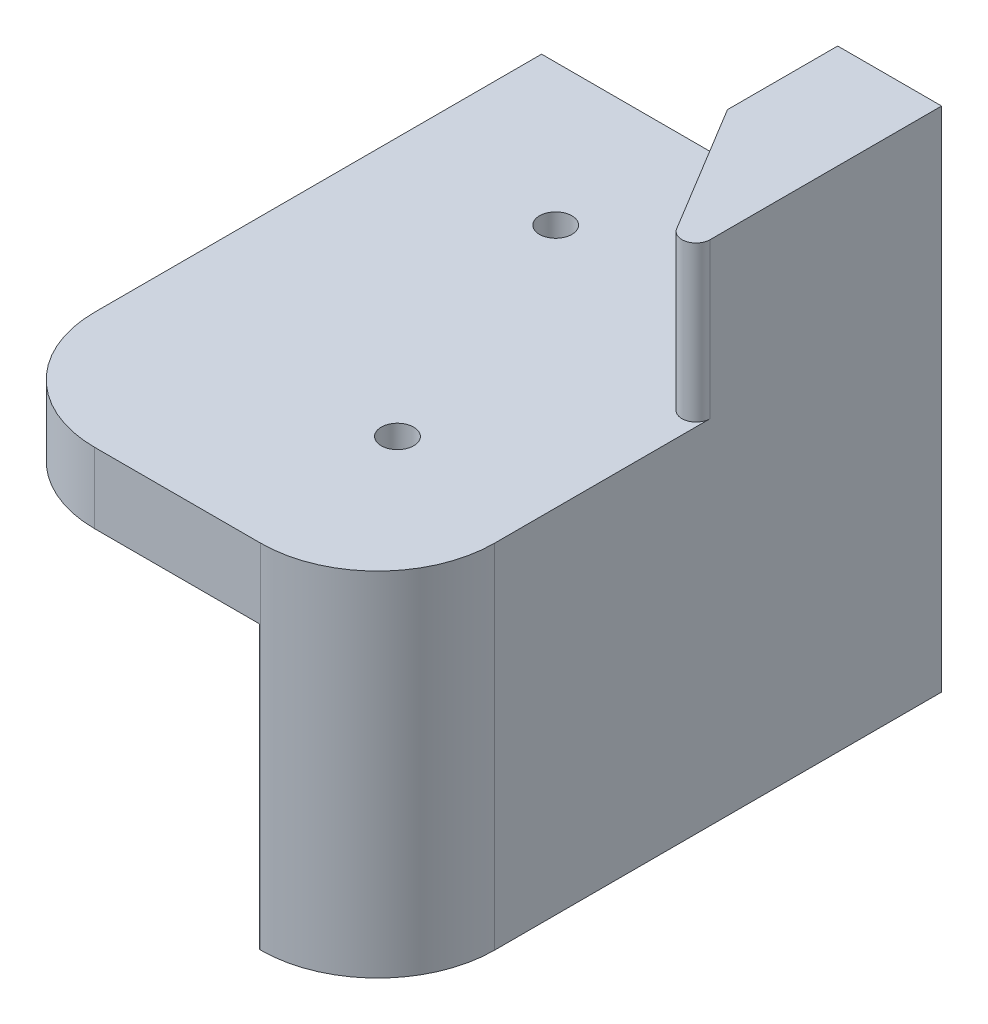
ISO-10303-21;
HEADER;
FILE_DESCRIPTION(('STEP AP214'),'2;1');
FILE_NAME('part.step','',(''),(''),'','','');
FILE_SCHEMA(('AUTOMOTIVE_DESIGN { 1 0 10303 214 1 1 1 1 }'));
ENDSEC;
DATA;
#1=APPLICATION_CONTEXT('core data for automotive mechanical design processes');
#2=APPLICATION_PROTOCOL_DEFINITION('international standard','automotive_design',2000,#1);
#3=PRODUCT_CONTEXT('',#1,'mechanical');
#4=PRODUCT('Part','Part','',(#3));
#5=PRODUCT_RELATED_PRODUCT_CATEGORY('part','',(#4));
#6=PRODUCT_DEFINITION_FORMATION('','',#4);
#7=PRODUCT_DEFINITION_CONTEXT('part definition',#1,'design');
#8=PRODUCT_DEFINITION('design','',#6,#7);
#9=PRODUCT_DEFINITION_SHAPE('','',#8);
#10=(LENGTH_UNIT() NAMED_UNIT(*) SI_UNIT(.MILLI.,.METRE.));
#11=(NAMED_UNIT(*) PLANE_ANGLE_UNIT() SI_UNIT($,.RADIAN.));
#12=(NAMED_UNIT(*) SI_UNIT($,.STERADIAN.) SOLID_ANGLE_UNIT());
#13=UNCERTAINTY_MEASURE_WITH_UNIT(LENGTH_MEASURE(1.E-05),#10,'distance_accuracy_value','');
#14=(GEOMETRIC_REPRESENTATION_CONTEXT(3) GLOBAL_UNCERTAINTY_ASSIGNED_CONTEXT((#13)) GLOBAL_UNIT_ASSIGNED_CONTEXT((#10,
#11,#12)) REPRESENTATION_CONTEXT('',''));
#15=CARTESIAN_POINT('',(0.,0.,0.));
#16=DIRECTION('',(0.,0.,1.));
#17=DIRECTION('',(1.,0.,0.));
#18=AXIS2_PLACEMENT_3D('',#15,#16,#17);
#19=CARTESIAN_POINT('',(0.,16.,0.));
#20=DIRECTION('',(0.,-1.,0.));
#21=DIRECTION('',(0.,0.,-1.));
#22=AXIS2_PLACEMENT_3D('',#19,#20,#21);
#23=PLANE('',#22);
#24=CARTESIAN_POINT('',(13.185,16.,-3.58458045626301));
#25=DIRECTION('',(0.,1.,0.));
#26=DIRECTION('',(0.,0.,1.));
#27=AXIS2_PLACEMENT_3D('',#24,#25,#26);
#28=CIRCLE('',#27,1.);
#29=CARTESIAN_POINT('',(12.3294124958943,16.,-3.0669222458402));
#30=VERTEX_POINT('',#29);
#31=CARTESIAN_POINT('',(14.185,16.,-3.58458045626301));
#32=VERTEX_POINT('',#31);
#33=EDGE_CURVE('E198',#30,#32,#28,.T.);
#34=ORIENTED_EDGE('',*,*,#33,.T.);
#35=DIRECTION('',(0.,0.,1.));
#36=VECTOR('',#35,1.);
#37=CARTESIAN_POINT('',(14.185,16.,20.));
#38=LINE('',#37,#36);
#39=CARTESIAN_POINT('',(14.185,16.,-20.));
#40=VERTEX_POINT('',#39);
#41=EDGE_CURVE('E39',#40,#32,#38,.T.);
#42=ORIENTED_EDGE('',*,*,#41,.F.);
#43=DIRECTION('',(1.,0.,0.));
#44=VECTOR('',#43,1.);
#45=CARTESIAN_POINT('',(-14.185,16.,-20.));
#46=LINE('',#45,#44);
#47=CARTESIAN_POINT('',(6.815,16.,-20.));
#48=VERTEX_POINT('',#47);
#49=EDGE_CURVE('E217',#48,#40,#46,.T.);
#50=ORIENTED_EDGE('',*,*,#49,.F.);
#51=DIRECTION('',(0.,0.,1.));
#52=VECTOR('',#51,1.);
#53=CARTESIAN_POINT('',(6.815,16.,-20.));
#54=LINE('',#53,#52);
#55=CARTESIAN_POINT('',(6.815,16.,-12.1811646725524));
#56=VERTEX_POINT('',#55);
#57=EDGE_CURVE('E11',#48,#56,#54,.T.);
#58=ORIENTED_EDGE('',*,*,#57,.T.);
#59=DIRECTION('',(0.517658210422817,0.,0.855587504105715));
#60=VECTOR('',#59,1.);
#61=CARTESIAN_POINT('',(6.815,16.,-12.1811646725524));
#62=LINE('',#61,#60);
#63=EDGE_CURVE('E44',#56,#30,#62,.T.);
#64=ORIENTED_EDGE('',*,*,#63,.T.);
#65=EDGE_LOOP('',(#34,#42,#50,#58,#64));
#66=FACE_BOUND('',#65,.T.);
#67=ADVANCED_FACE('F36',(#66),#23,.F.);
#68=CARTESIAN_POINT('',(0.,5.,0.));
#69=DIRECTION('',(0.,-1.,0.));
#70=DIRECTION('',(0.,0.,-1.));
#71=AXIS2_PLACEMENT_3D('',#68,#69,#70);
#72=PLANE('',#71);
#73=CARTESIAN_POINT('',(4.185,5.,8.59255496159686));
#74=DIRECTION('',(0.,-1.,0.));
#75=DIRECTION('',(0.,0.,-1.));
#76=AXIS2_PLACEMENT_3D('',#73,#74,#75);
#77=CIRCLE('',#76,1.15);
#78=CARTESIAN_POINT('',(4.185,5.,7.44255496159686));
#79=VERTEX_POINT('',#78);
#80=EDGE_CURVE('E138',#79,#79,#77,.T.);
#81=ORIENTED_EDGE('',*,*,#80,.T.);
#82=EDGE_LOOP('',(#81));
#83=FACE_BOUND('',#82,.T.);
#84=CARTESIAN_POINT('',(-3.185,5.,-10.));
#85=DIRECTION('',(0.,-1.,0.));
#86=DIRECTION('',(0.,0.,-1.));
#87=AXIS2_PLACEMENT_3D('',#84,#85,#86);
#88=CIRCLE('',#87,1.1485231685851);
#89=CARTESIAN_POINT('',(-3.185,5.,-11.1485231685851));
#90=VERTEX_POINT('',#89);
#91=EDGE_CURVE('E165',#90,#90,#88,.T.);
#92=ORIENTED_EDGE('',*,*,#91,.T.);
#93=EDGE_LOOP('',(#92));
#94=FACE_BOUND('',#93,.T.);
#95=DIRECTION('',(0.,0.,1.));
#96=VECTOR('',#95,1.);
#97=CARTESIAN_POINT('',(-14.185,5.,20.));
#98=LINE('',#97,#96);
#99=CARTESIAN_POINT('',(-14.185,5.,-20.));
#100=VERTEX_POINT('',#99);
#101=CARTESIAN_POINT('',(-14.185,5.,11.7));
#102=VERTEX_POINT('',#101);
#103=EDGE_CURVE('E176',#100,#102,#98,.T.);
#104=ORIENTED_EDGE('',*,*,#103,.T.);
#105=CARTESIAN_POINT('',(-5.885,5.,11.7));
#106=DIRECTION('',(0.,-1.,0.));
#107=DIRECTION('',(0.,0.,-1.));
#108=AXIS2_PLACEMENT_3D('',#105,#106,#107);
#109=CIRCLE('',#108,8.3);
#110=CARTESIAN_POINT('',(-5.885,5.,20.));
#111=VERTEX_POINT('',#110);
#112=EDGE_CURVE('E211',#102,#111,#109,.F.);
#113=ORIENTED_EDGE('',*,*,#112,.T.);
#114=DIRECTION('',(1.,0.,0.));
#115=VECTOR('',#114,1.);
#116=CARTESIAN_POINT('',(-14.185,5.,20.));
#117=LINE('',#116,#115);
#118=CARTESIAN_POINT('',(5.885,5.,20.));
#119=VERTEX_POINT('',#118);
#120=EDGE_CURVE('E178',#111,#119,#117,.T.);
#121=ORIENTED_EDGE('',*,*,#120,.T.);
#122=CARTESIAN_POINT('',(5.885,5.,11.7));
#123=DIRECTION('',(0.,-1.,0.));
#124=DIRECTION('',(0.,0.,-1.));
#125=AXIS2_PLACEMENT_3D('',#122,#123,#124);
#126=CIRCLE('',#125,8.3);
#127=CARTESIAN_POINT('',(14.185,5.,11.7));
#128=VERTEX_POINT('',#127);
#129=EDGE_CURVE('E209',#119,#128,#126,.F.);
#130=ORIENTED_EDGE('',*,*,#129,.T.);
#131=DIRECTION('',(0.,0.,-1.));
#132=VECTOR('',#131,1.);
#133=CARTESIAN_POINT('',(14.185,5.,20.));
#134=LINE('',#133,#132);
#135=CARTESIAN_POINT('',(14.185,5.,-3.58458045626301));
#136=VERTEX_POINT('',#135);
#137=EDGE_CURVE('E171',#128,#136,#134,.T.);
#138=ORIENTED_EDGE('',*,*,#137,.T.);
#139=CARTESIAN_POINT('',(13.185,5.,-3.58458045626301));
#140=DIRECTION('',(0.,-1.,0.));
#141=DIRECTION('',(0.,0.,-1.));
#142=AXIS2_PLACEMENT_3D('',#139,#140,#141);
#143=CIRCLE('',#142,1.);
#144=CARTESIAN_POINT('',(12.3294124958943,5.,-3.0669222458402));
#145=VERTEX_POINT('',#144);
#146=EDGE_CURVE('E131',#136,#145,#143,.T.);
#147=ORIENTED_EDGE('',*,*,#146,.T.);
#148=DIRECTION('',(0.517658210422817,0.,0.855587504105715));
#149=VECTOR('',#148,1.);
#150=CARTESIAN_POINT('',(6.815,5.,-12.1811646725524));
#151=LINE('',#150,#149);
#152=CARTESIAN_POINT('',(6.815,5.,-12.1811646725524));
#153=VERTEX_POINT('',#152);
#154=EDGE_CURVE('E124',#153,#145,#151,.T.);
#155=ORIENTED_EDGE('',*,*,#154,.F.);
#156=DIRECTION('',(0.,0.,1.));
#157=VECTOR('',#156,1.);
#158=CARTESIAN_POINT('',(6.815,5.,-20.));
#159=LINE('',#158,#157);
#160=CARTESIAN_POINT('',(6.815,5.,-20.));
#161=VERTEX_POINT('',#160);
#162=EDGE_CURVE('E128',#161,#153,#159,.T.);
#163=ORIENTED_EDGE('',*,*,#162,.F.);
#164=DIRECTION('',(-1.,0.,0.));
#165=VECTOR('',#164,1.);
#166=CARTESIAN_POINT('',(-14.185,5.,-20.));
#167=LINE('',#166,#165);
#168=EDGE_CURVE('E173',#161,#100,#167,.T.);
#169=ORIENTED_EDGE('',*,*,#168,.T.);
#170=EDGE_LOOP('',(#104,#113,#121,#130,#138,#147,#155,#163,#169));
#171=FACE_BOUND('',#170,.T.);
#172=ADVANCED_FACE('F127',(#83,#94,#171),#72,.F.);
#173=CARTESIAN_POINT('',(14.185,5.,20.));
#174=DIRECTION('',(-1.,0.,0.));
#175=DIRECTION('',(0.,0.,1.));
#176=AXIS2_PLACEMENT_3D('',#173,#174,#175);
#177=PLANE('',#176);
#178=DIRECTION('',(0.,-1.,0.));
#179=VECTOR('',#178,1.);
#180=CARTESIAN_POINT('',(14.185,5.,-20.));
#181=LINE('',#180,#179);
#182=CARTESIAN_POINT('',(14.185,-20.,-20.));
#183=VERTEX_POINT('',#182);
#184=EDGE_CURVE('E189',#40,#183,#181,.T.);
#185=ORIENTED_EDGE('',*,*,#184,.F.);
#186=ORIENTED_EDGE('',*,*,#41,.T.);
#187=DIRECTION('',(0.,-1.,0.));
#188=VECTOR('',#187,1.);
#189=CARTESIAN_POINT('',(14.185,5.,-3.58458045626301));
#190=LINE('',#189,#188);
#191=EDGE_CURVE('E191',#32,#136,#190,.T.);
#192=ORIENTED_EDGE('',*,*,#191,.T.);
#193=ORIENTED_EDGE('',*,*,#137,.F.);
#194=DIRECTION('',(0.,-1.,0.));
#195=VECTOR('',#194,1.);
#196=CARTESIAN_POINT('',(14.185,5.,11.7));
#197=LINE('',#196,#195);
#198=CARTESIAN_POINT('',(14.185,-20.,11.7));
#199=VERTEX_POINT('',#198);
#200=EDGE_CURVE('E213',#128,#199,#197,.T.);
#201=ORIENTED_EDGE('',*,*,#200,.T.);
#202=DIRECTION('',(0.,0.,1.));
#203=VECTOR('',#202,1.);
#204=CARTESIAN_POINT('',(14.185,-20.,20.));
#205=LINE('',#204,#203);
#206=EDGE_CURVE('E151',#183,#199,#205,.T.);
#207=ORIENTED_EDGE('',*,*,#206,.F.);
#208=EDGE_LOOP('',(#185,#186,#192,#193,#201,#207));
#209=FACE_BOUND('',#208,.T.);
#210=ADVANCED_FACE('F222',(#209),#177,.F.);
#211=CARTESIAN_POINT('',(-14.185,5.,-20.));
#212=DIRECTION('',(0.,0.,1.));
#213=DIRECTION('',(1.,0.,0.));
#214=AXIS2_PLACEMENT_3D('',#211,#212,#213);
#215=PLANE('',#214);
#216=DIRECTION('',(0.,-1.,0.));
#217=VECTOR('',#216,1.);
#218=CARTESIAN_POINT('',(6.815,16.,-20.));
#219=LINE('',#218,#217);
#220=EDGE_CURVE('E137',#48,#161,#219,.T.);
#221=ORIENTED_EDGE('',*,*,#220,.F.);
#222=ORIENTED_EDGE('',*,*,#49,.T.);
#223=ORIENTED_EDGE('',*,*,#184,.T.);
#224=DIRECTION('',(1.,0.,0.));
#225=VECTOR('',#224,1.);
#226=CARTESIAN_POINT('',(5.81500000000001,-20.,-20.));
#227=LINE('',#226,#225);
#228=CARTESIAN_POINT('',(5.81500000000001,-20.,-20.));
#229=VERTEX_POINT('',#228);
#230=EDGE_CURVE('E148',#229,#183,#227,.T.);
#231=ORIENTED_EDGE('',*,*,#230,.F.);
#232=DIRECTION('',(0.,1.,0.));
#233=VECTOR('',#232,1.);
#234=CARTESIAN_POINT('',(5.81500000000001,-20.,-20.));
#235=LINE('',#234,#233);
#236=CARTESIAN_POINT('',(5.81500000000001,0.,-20.));
#237=VERTEX_POINT('',#236);
#238=EDGE_CURVE('E161',#229,#237,#235,.T.);
#239=ORIENTED_EDGE('',*,*,#238,.T.);
#240=DIRECTION('',(-1.,0.,0.));
#241=VECTOR('',#240,1.);
#242=CARTESIAN_POINT('',(-14.185,0.,-20.));
#243=LINE('',#242,#241);
#244=CARTESIAN_POINT('',(-14.185,0.,-20.));
#245=VERTEX_POINT('',#244);
#246=EDGE_CURVE('E168',#237,#245,#243,.T.);
#247=ORIENTED_EDGE('',*,*,#246,.T.);
#248=DIRECTION('',(0.,-1.,0.));
#249=VECTOR('',#248,1.);
#250=CARTESIAN_POINT('',(-14.185,5.,-20.));
#251=LINE('',#250,#249);
#252=EDGE_CURVE('E181',#100,#245,#251,.T.);
#253=ORIENTED_EDGE('',*,*,#252,.F.);
#254=ORIENTED_EDGE('',*,*,#168,.F.);
#255=EDGE_LOOP('',(#221,#222,#223,#231,#239,#247,#253,#254));
#256=FACE_BOUND('',#255,.T.);
#257=ADVANCED_FACE('F263',(#256),#215,.F.);
#258=CARTESIAN_POINT('',(-14.185,5.,20.));
#259=DIRECTION('',(1.,0.,0.));
#260=DIRECTION('',(0.,0.,-1.));
#261=AXIS2_PLACEMENT_3D('',#258,#259,#260);
#262=PLANE('',#261);
#263=DIRECTION('',(0.,0.,1.));
#264=VECTOR('',#263,1.);
#265=CARTESIAN_POINT('',(-14.185,0.,20.));
#266=LINE('',#265,#264);
#267=CARTESIAN_POINT('',(-14.185,0.,11.7));
#268=VERTEX_POINT('',#267);
#269=EDGE_CURVE('E183',#245,#268,#266,.T.);
#270=ORIENTED_EDGE('',*,*,#269,.T.);
#271=DIRECTION('',(0.,-1.,0.));
#272=VECTOR('',#271,1.);
#273=CARTESIAN_POINT('',(-14.185,5.,11.7));
#274=LINE('',#273,#272);
#275=EDGE_CURVE('E207',#268,#102,#274,.F.);
#276=ORIENTED_EDGE('',*,*,#275,.T.);
#277=ORIENTED_EDGE('',*,*,#103,.F.);
#278=ORIENTED_EDGE('',*,*,#252,.T.);
#279=EDGE_LOOP('',(#270,#276,#277,#278));
#280=FACE_BOUND('',#279,.T.);
#281=ADVANCED_FACE('F276',(#280),#262,.F.);
#282=CARTESIAN_POINT('',(-14.185,5.,20.));
#283=DIRECTION('',(0.,0.,-1.));
#284=DIRECTION('',(-1.,0.,0.));
#285=AXIS2_PLACEMENT_3D('',#282,#283,#284);
#286=PLANE('',#285);
#287=ORIENTED_EDGE('',*,*,#120,.F.);
#288=DIRECTION('',(0.,-1.,0.));
#289=VECTOR('',#288,1.);
#290=CARTESIAN_POINT('',(-5.885,5.,20.));
#291=LINE('',#290,#289);
#292=CARTESIAN_POINT('',(-5.885,0.,20.));
#293=VERTEX_POINT('',#292);
#294=EDGE_CURVE('E202',#111,#293,#291,.T.);
#295=ORIENTED_EDGE('',*,*,#294,.T.);
#296=DIRECTION('',(1.,0.,0.));
#297=VECTOR('',#296,1.);
#298=CARTESIAN_POINT('',(-14.185,0.,20.));
#299=LINE('',#298,#297);
#300=CARTESIAN_POINT('',(5.815,0.,20.));
#301=VERTEX_POINT('',#300);
#302=EDGE_CURVE('E174',#293,#301,#299,.T.);
#303=ORIENTED_EDGE('',*,*,#302,.T.);
#304=DIRECTION('',(0.,1.,0.));
#305=VECTOR('',#304,1.);
#306=CARTESIAN_POINT('',(5.815,-20.,20.));
#307=LINE('',#306,#305);
#308=CARTESIAN_POINT('',(5.815,-20.,20.));
#309=VERTEX_POINT('',#308);
#310=EDGE_CURVE('E156',#309,#301,#307,.T.);
#311=ORIENTED_EDGE('',*,*,#310,.F.);
#312=DIRECTION('',(-1.,0.,0.));
#313=VECTOR('',#312,1.);
#314=CARTESIAN_POINT('',(5.815,-20.,20.));
#315=LINE('',#314,#313);
#316=CARTESIAN_POINT('',(5.885,-20.,20.));
#317=VERTEX_POINT('',#316);
#318=EDGE_CURVE('E154',#317,#309,#315,.T.);
#319=ORIENTED_EDGE('',*,*,#318,.F.);
#320=DIRECTION('',(0.,-1.,0.));
#321=VECTOR('',#320,1.);
#322=CARTESIAN_POINT('',(5.885,5.,20.));
#323=LINE('',#322,#321);
#324=EDGE_CURVE('E197',#317,#119,#323,.F.);
#325=ORIENTED_EDGE('',*,*,#324,.T.);
#326=EDGE_LOOP('',(#287,#295,#303,#311,#319,#325));
#327=FACE_BOUND('',#326,.T.);
#328=ADVANCED_FACE('F281',(#327),#286,.F.);
#329=CARTESIAN_POINT('',(0.,0.,0.));
#330=DIRECTION('',(0.,-1.,0.));
#331=DIRECTION('',(0.,0.,-1.));
#332=AXIS2_PLACEMENT_3D('',#329,#330,#331);
#333=PLANE('',#332);
#334=CARTESIAN_POINT('',(4.185,0.,8.59255496159686));
#335=DIRECTION('',(0.,-1.,0.));
#336=DIRECTION('',(0.,0.,-1.));
#337=AXIS2_PLACEMENT_3D('',#334,#335,#336);
#338=CIRCLE('',#337,1.15);
#339=CARTESIAN_POINT('',(4.185,0.,7.44255496159686));
#340=VERTEX_POINT('',#339);
#341=EDGE_CURVE('E453',#340,#340,#338,.T.);
#342=ORIENTED_EDGE('',*,*,#341,.F.);
#343=EDGE_LOOP('',(#342));
#344=FACE_BOUND('',#343,.T.);
#345=ORIENTED_EDGE('',*,*,#302,.F.);
#346=CARTESIAN_POINT('',(-5.885,0.,11.7));
#347=DIRECTION('',(0.,-1.,0.));
#348=DIRECTION('',(0.,0.,-1.));
#349=AXIS2_PLACEMENT_3D('',#346,#347,#348);
#350=CIRCLE('',#349,8.3);
#351=EDGE_CURVE('E205',#293,#268,#350,.T.);
#352=ORIENTED_EDGE('',*,*,#351,.T.);
#353=ORIENTED_EDGE('',*,*,#269,.F.);
#354=ORIENTED_EDGE('',*,*,#246,.F.);
#355=DIRECTION('',(0.,0.,-1.));
#356=VECTOR('',#355,1.);
#357=CARTESIAN_POINT('',(5.815,0.,20.));
#358=LINE('',#357,#356);
#359=EDGE_CURVE('E142',#301,#237,#358,.T.);
#360=ORIENTED_EDGE('',*,*,#359,.F.);
#361=EDGE_LOOP('',(#345,#352,#353,#354,#360));
#362=FACE_BOUND('',#361,.T.);
#363=CARTESIAN_POINT('',(-3.185,0.,-10.));
#364=DIRECTION('',(0.,-1.,0.));
#365=DIRECTION('',(0.,0.,-1.));
#366=AXIS2_PLACEMENT_3D('',#363,#364,#365);
#367=CIRCLE('',#366,1.1485231685851);
#368=CARTESIAN_POINT('',(-3.185,0.,-11.1485231685851));
#369=VERTEX_POINT('',#368);
#370=EDGE_CURVE('E164',#369,#369,#367,.T.);
#371=ORIENTED_EDGE('',*,*,#370,.F.);
#372=EDGE_LOOP('',(#371));
#373=FACE_BOUND('',#372,.T.);
#374=ADVANCED_FACE('F271',(#344,#362,#373),#333,.T.);
#375=CARTESIAN_POINT('',(-3.185,5.,-10.));
#376=DIRECTION('',(0.,-1.,0.));
#377=DIRECTION('',(0.,0.,-1.));
#378=AXIS2_PLACEMENT_3D('',#375,#376,#377);
#379=CYLINDRICAL_SURFACE('',#378,1.1485231685851);
#380=ORIENTED_EDGE('',*,*,#91,.F.);
#381=EDGE_LOOP('',(#380));
#382=FACE_BOUND('',#381,.T.);
#383=ORIENTED_EDGE('',*,*,#370,.T.);
#384=EDGE_LOOP('',(#383));
#385=FACE_BOUND('',#384,.T.);
#386=ADVANCED_FACE('F288',(#382,#385),#379,.F.);
#387=CARTESIAN_POINT('',(5.815,-20.,20.));
#388=DIRECTION('',(1.,0.,0.));
#389=DIRECTION('',(0.,0.,-1.));
#390=AXIS2_PLACEMENT_3D('',#387,#388,#389);
#391=PLANE('',#390);
#392=ORIENTED_EDGE('',*,*,#359,.T.);
#393=ORIENTED_EDGE('',*,*,#238,.F.);
#394=DIRECTION('',(0.,0.,-1.));
#395=VECTOR('',#394,1.);
#396=CARTESIAN_POINT('',(5.815,-20.,20.));
#397=LINE('',#396,#395);
#398=EDGE_CURVE('E145',#309,#229,#397,.T.);
#399=ORIENTED_EDGE('',*,*,#398,.F.);
#400=ORIENTED_EDGE('',*,*,#310,.T.);
#401=EDGE_LOOP('',(#392,#393,#399,#400));
#402=FACE_BOUND('',#401,.T.);
#403=ADVANCED_FACE('F267',(#402),#391,.F.);
#404=CARTESIAN_POINT('',(0.,-20.,0.));
#405=DIRECTION('',(0.,-1.,0.));
#406=DIRECTION('',(0.,0.,-1.));
#407=AXIS2_PLACEMENT_3D('',#404,#405,#406);
#408=PLANE('',#407);
#409=ORIENTED_EDGE('',*,*,#206,.T.);
#410=CARTESIAN_POINT('',(5.885,-20.,11.7));
#411=DIRECTION('',(0.,-1.,0.));
#412=DIRECTION('',(0.,0.,-1.));
#413=AXIS2_PLACEMENT_3D('',#410,#411,#412);
#414=CIRCLE('',#413,8.3);
#415=EDGE_CURVE('E216',#199,#317,#414,.T.);
#416=ORIENTED_EDGE('',*,*,#415,.T.);
#417=ORIENTED_EDGE('',*,*,#318,.T.);
#418=ORIENTED_EDGE('',*,*,#398,.T.);
#419=ORIENTED_EDGE('',*,*,#230,.T.);
#420=EDGE_LOOP('',(#409,#416,#417,#418,#419));
#421=FACE_BOUND('',#420,.T.);
#422=ADVANCED_FACE('F259',(#421),#408,.T.);
#423=CARTESIAN_POINT('',(6.815,16.,-20.));
#424=DIRECTION('',(1.,0.,0.));
#425=DIRECTION('',(0.,0.,-1.));
#426=AXIS2_PLACEMENT_3D('',#423,#424,#425);
#427=PLANE('',#426);
#428=ORIENTED_EDGE('',*,*,#162,.T.);
#429=DIRECTION('',(0.,-1.,0.));
#430=VECTOR('',#429,1.);
#431=CARTESIAN_POINT('',(6.815,16.,-12.1811646725524));
#432=LINE('',#431,#430);
#433=EDGE_CURVE('E133',#56,#153,#432,.T.);
#434=ORIENTED_EDGE('',*,*,#433,.F.);
#435=ORIENTED_EDGE('',*,*,#57,.F.);
#436=ORIENTED_EDGE('',*,*,#220,.T.);
#437=EDGE_LOOP('',(#428,#434,#435,#436));
#438=FACE_BOUND('',#437,.T.);
#439=ADVANCED_FACE('F135',(#438),#427,.F.);
#440=CARTESIAN_POINT('',(6.815,16.,-12.1811646725524));
#441=DIRECTION('',(0.855587504105715,0.,-0.517658210422817));
#442=DIRECTION('',(-0.517658210422817,0.,-0.855587504105715));
#443=AXIS2_PLACEMENT_3D('',#440,#441,#442);
#444=PLANE('',#443);
#445=ORIENTED_EDGE('',*,*,#154,.T.);
#446=DIRECTION('',(0.,-1.,0.));
#447=VECTOR('',#446,1.);
#448=CARTESIAN_POINT('',(12.3294124958943,16.,-3.06692224584019));
#449=LINE('',#448,#447);
#450=EDGE_CURVE('E194',#145,#30,#449,.F.);
#451=ORIENTED_EDGE('',*,*,#450,.T.);
#452=ORIENTED_EDGE('',*,*,#63,.F.);
#453=ORIENTED_EDGE('',*,*,#433,.T.);
#454=EDGE_LOOP('',(#445,#451,#452,#453));
#455=FACE_BOUND('',#454,.T.);
#456=ADVANCED_FACE('F140',(#455),#444,.F.);
#457=CARTESIAN_POINT('',(4.185,21.,8.59255496159686));
#458=DIRECTION('',(0.,-1.,0.));
#459=DIRECTION('',(0.,0.,-1.));
#460=AXIS2_PLACEMENT_3D('',#457,#458,#459);
#461=CYLINDRICAL_SURFACE('',#460,1.15);
#462=CARTESIAN_POINT('',(4.185,0.,7.44255496159686));
#463=CARTESIAN_POINT('',(4.185,0.0520833333333334,7.44255496159686));
#464=CARTESIAN_POINT('',(4.185,0.104166666666667,7.44255496159686));
#465=CARTESIAN_POINT('',(4.185,0.208333333333334,7.44255496159686));
#466=CARTESIAN_POINT('',(4.185,0.260416666666667,7.44255496159686));
#467=CARTESIAN_POINT('',(4.185,0.364583333333334,7.44255496159686));
#468=CARTESIAN_POINT('',(4.185,0.416666666666667,7.44255496159686));
#469=CARTESIAN_POINT('',(4.185,0.520833333333334,7.44255496159686));
#470=CARTESIAN_POINT('',(4.185,0.572916666666667,7.44255496159686));
#471=CARTESIAN_POINT('',(4.185,0.677083333333334,7.44255496159686));
#472=CARTESIAN_POINT('',(4.185,0.729166666666667,7.44255496159686));
#473=CARTESIAN_POINT('',(4.185,0.833333333333334,7.44255496159686));
#474=CARTESIAN_POINT('',(4.185,0.885416666666668,7.44255496159686));
#475=CARTESIAN_POINT('',(4.185,0.989583333333334,7.44255496159686));
#476=CARTESIAN_POINT('',(4.185,1.04166666666667,7.44255496159686));
#477=CARTESIAN_POINT('',(4.185,1.14583333333333,7.44255496159686));
#478=CARTESIAN_POINT('',(4.185,1.19791666666667,7.44255496159686));
#479=CARTESIAN_POINT('',(4.185,1.30208333333333,7.44255496159686));
#480=CARTESIAN_POINT('',(4.185,1.35416666666667,7.44255496159686));
#481=CARTESIAN_POINT('',(4.185,1.45833333333333,7.44255496159686));
#482=CARTESIAN_POINT('',(4.185,1.51041666666667,7.44255496159686));
#483=CARTESIAN_POINT('',(4.185,1.61458333333333,7.44255496159686));
#484=CARTESIAN_POINT('',(4.185,1.66666666666667,7.44255496159686));
#485=CARTESIAN_POINT('',(4.185,1.77083333333334,7.44255496159686));
#486=CARTESIAN_POINT('',(4.185,1.82291666666667,7.44255496159686));
#487=CARTESIAN_POINT('',(4.185,1.92708333333334,7.44255496159686));
#488=CARTESIAN_POINT('',(4.185,1.97916666666667,7.44255496159686));
#489=CARTESIAN_POINT('',(4.185,2.08333333333334,7.44255496159686));
#490=CARTESIAN_POINT('',(4.185,2.13541666666667,7.44255496159686));
#491=CARTESIAN_POINT('',(4.185,2.23958333333334,7.44255496159686));
#492=CARTESIAN_POINT('',(4.185,2.29166666666667,7.44255496159686));
#493=CARTESIAN_POINT('',(4.185,2.39583333333334,7.44255496159686));
#494=CARTESIAN_POINT('',(4.185,2.44791666666667,7.44255496159686));
#495=CARTESIAN_POINT('',(4.185,2.55208333333334,7.44255496159686));
#496=CARTESIAN_POINT('',(4.185,2.60416666666667,7.44255496159686));
#497=CARTESIAN_POINT('',(4.185,2.70833333333334,7.44255496159686));
#498=CARTESIAN_POINT('',(4.185,2.76041666666667,7.44255496159686));
#499=CARTESIAN_POINT('',(4.185,2.86458333333334,7.44255496159686));
#500=CARTESIAN_POINT('',(4.185,2.91666666666667,7.44255496159686));
#501=CARTESIAN_POINT('',(4.185,3.02083333333334,7.44255496159686));
#502=CARTESIAN_POINT('',(4.185,3.07291666666667,7.44255496159686));
#503=CARTESIAN_POINT('',(4.185,3.17708333333334,7.44255496159686));
#504=CARTESIAN_POINT('',(4.185,3.22916666666667,7.44255496159686));
#505=CARTESIAN_POINT('',(4.185,3.33333333333334,7.44255496159686));
#506=CARTESIAN_POINT('',(4.185,3.38541666666667,7.44255496159686));
#507=CARTESIAN_POINT('',(4.185,3.48958333333334,7.44255496159686));
#508=CARTESIAN_POINT('',(4.185,3.54166666666667,7.44255496159686));
#509=CARTESIAN_POINT('',(4.185,3.64583333333334,7.44255496159686));
#510=CARTESIAN_POINT('',(4.185,3.69791666666667,7.44255496159686));
#511=CARTESIAN_POINT('',(4.185,3.80208333333334,7.44255496159686));
#512=CARTESIAN_POINT('',(4.185,3.85416666666667,7.44255496159686));
#513=CARTESIAN_POINT('',(4.185,3.95833333333334,7.44255496159686));
#514=CARTESIAN_POINT('',(4.185,4.01041666666667,7.44255496159686));
#515=CARTESIAN_POINT('',(4.185,4.11458333333334,7.44255496159686));
#516=CARTESIAN_POINT('',(4.185,4.16666666666667,7.44255496159686));
#517=CARTESIAN_POINT('',(4.185,4.27083333333334,7.44255496159686));
#518=CARTESIAN_POINT('',(4.185,4.32291666666667,7.44255496159686));
#519=CARTESIAN_POINT('',(4.185,4.42708333333334,7.44255496159686));
#520=CARTESIAN_POINT('',(4.185,4.47916666666667,7.44255496159686));
#521=CARTESIAN_POINT('',(4.185,4.58333333333334,7.44255496159686));
#522=CARTESIAN_POINT('',(4.185,4.63541666666667,7.44255496159686));
#523=CARTESIAN_POINT('',(4.185,4.73958333333334,7.44255496159686));
#524=CARTESIAN_POINT('',(4.185,4.79166666666667,7.44255496159686));
#525=CARTESIAN_POINT('',(4.185,4.89583333333334,7.44255496159686));
#526=CARTESIAN_POINT('',(4.185,4.94791666666667,7.44255496159686));
#527=CARTESIAN_POINT('',(4.185,5.,7.44255496159686));
#528=B_SPLINE_CURVE_WITH_KNOTS('',3,(#462,#463,#464,#465,#466,#467,#468,#469,#470,#471,#472,
#473,#474,#475,#476,#477,#478,#479,#480,#481,#482,#483,#484,#485,#486,#487,#488,#489,#490,#491,
#492,#493,#494,#495,#496,#497,#498,#499,#500,#501,#502,#503,#504,#505,#506,#507,#508,#509,#510,
#511,#512,#513,#514,#515,#516,#517,#518,#519,#520,#521,#522,#523,#524,#525,#526,#527),
.UNSPECIFIED.,.F.,.F.,(4,2,2,2,2,2,2,2,2,2,2,2,2,2,2,2,2,2,2,2,2,2,2,2,2,2,2,2,2,2,2,2,4),(0.,
0.15625,0.3125,0.46875,0.625000000000001,0.781250000000001,0.937500000000001,1.09375,1.25,
1.40625,1.5625,1.71875,1.875,2.03125,2.1875,2.34375,2.5,2.65625,2.8125,2.96875,3.125,3.28125,
3.4375,3.59375,3.75,3.90625,4.0625,4.21875,4.375,4.53125,4.6875,4.84375,5.),.UNSPECIFIED.);
#529=EDGE_CURVE('BSEAM232',#340,#79,#528,.T.);
#530=ORIENTED_EDGE('',*,*,#341,.T.);
#531=ORIENTED_EDGE('',*,*,#80,.F.);
#532=ORIENTED_EDGE('',*,*,#529,.T.);
#533=ORIENTED_EDGE('',*,*,#529,.F.);
#534=EDGE_LOOP('',(#530,#532,#531,#533));
#535=FACE_BOUND('',#534,.T.);
#536=ADVANCED_FACE('F232',(#535),#461,.F.);
#537=CARTESIAN_POINT('',(13.185,5.,-3.58458045626301));
#538=DIRECTION('',(0.,-1.,0.));
#539=DIRECTION('',(0.,0.,-1.));
#540=AXIS2_PLACEMENT_3D('',#537,#538,#539);
#541=CYLINDRICAL_SURFACE('',#540,1.);
#542=ORIENTED_EDGE('',*,*,#33,.F.);
#543=ORIENTED_EDGE('',*,*,#450,.F.);
#544=ORIENTED_EDGE('',*,*,#146,.F.);
#545=ORIENTED_EDGE('',*,*,#191,.F.);
#546=EDGE_LOOP('',(#542,#543,#544,#545));
#547=FACE_BOUND('',#546,.T.);
#548=ADVANCED_FACE('F229',(#547),#541,.T.);
#549=CARTESIAN_POINT('',(-5.885,5.,11.7));
#550=DIRECTION('',(0.,-1.,0.));
#551=DIRECTION('',(0.,0.,-1.));
#552=AXIS2_PLACEMENT_3D('',#549,#550,#551);
#553=CYLINDRICAL_SURFACE('',#552,8.3);
#554=ORIENTED_EDGE('',*,*,#112,.F.);
#555=ORIENTED_EDGE('',*,*,#275,.F.);
#556=ORIENTED_EDGE('',*,*,#351,.F.);
#557=ORIENTED_EDGE('',*,*,#294,.F.);
#558=EDGE_LOOP('',(#554,#555,#556,#557));
#559=FACE_BOUND('',#558,.T.);
#560=ADVANCED_FACE('F231',(#559),#553,.T.);
#561=CARTESIAN_POINT('',(5.885,5.,11.7));
#562=DIRECTION('',(0.,-1.,0.));
#563=DIRECTION('',(0.,0.,-1.));
#564=AXIS2_PLACEMENT_3D('',#561,#562,#563);
#565=CYLINDRICAL_SURFACE('',#564,8.3);
#566=ORIENTED_EDGE('',*,*,#129,.F.);
#567=ORIENTED_EDGE('',*,*,#324,.F.);
#568=ORIENTED_EDGE('',*,*,#415,.F.);
#569=ORIENTED_EDGE('',*,*,#200,.F.);
#570=EDGE_LOOP('',(#566,#567,#568,#569));
#571=FACE_BOUND('',#570,.T.);
#572=ADVANCED_FACE('F238',(#571),#565,.T.);
#573=CLOSED_SHELL('',(#67,#172,#210,#257,#281,#328,#374,#386,#403,#422,#439,#456,#536,#548,#560,#572));
#574=MANIFOLD_SOLID_BREP('B2',#573);
#575=ADVANCED_BREP_SHAPE_REPRESENTATION('',(#18,#574),#14);
#576=SHAPE_DEFINITION_REPRESENTATION(#9,#575);
ENDSEC;
END-ISO-10303-21;
